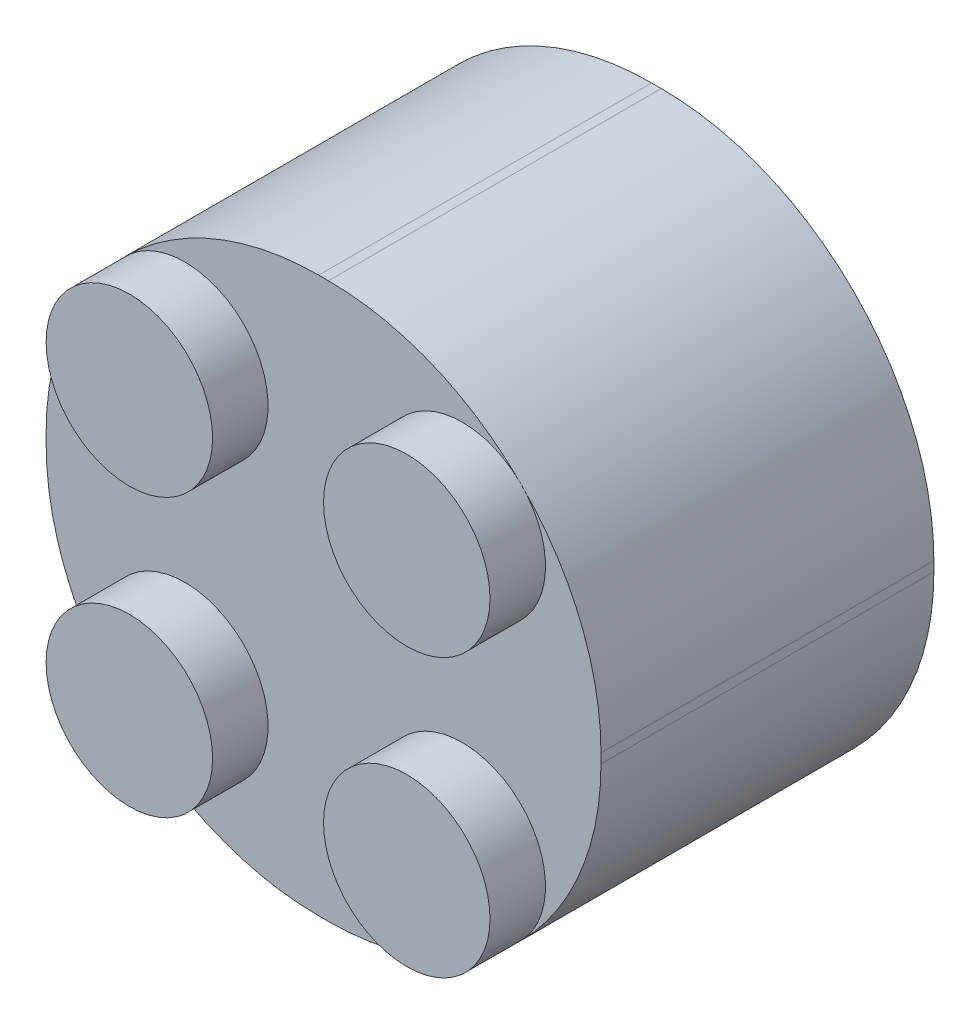
ISO-10303-21;
HEADER;
FILE_DESCRIPTION(('STEP AP214'),'2;1');
FILE_NAME('part.step','',(''),(''),'','','');
FILE_SCHEMA(('AUTOMOTIVE_DESIGN { 1 0 10303 214 1 1 1 1 }'));
ENDSEC;
DATA;
#1=APPLICATION_CONTEXT('core data for automotive mechanical design processes');
#2=APPLICATION_PROTOCOL_DEFINITION('international standard','automotive_design',2000,#1);
#3=PRODUCT_CONTEXT('',#1,'mechanical');
#4=PRODUCT('Part','Part','',(#3));
#5=PRODUCT_RELATED_PRODUCT_CATEGORY('part','',(#4));
#6=PRODUCT_DEFINITION_FORMATION('','',#4);
#7=PRODUCT_DEFINITION_CONTEXT('part definition',#1,'design');
#8=PRODUCT_DEFINITION('design','',#6,#7);
#9=PRODUCT_DEFINITION_SHAPE('','',#8);
#10=(LENGTH_UNIT() NAMED_UNIT(*) SI_UNIT(.MILLI.,.METRE.));
#11=(NAMED_UNIT(*) PLANE_ANGLE_UNIT() SI_UNIT($,.RADIAN.));
#12=(NAMED_UNIT(*) SI_UNIT($,.STERADIAN.) SOLID_ANGLE_UNIT());
#13=UNCERTAINTY_MEASURE_WITH_UNIT(LENGTH_MEASURE(1.E-05),#10,'distance_accuracy_value','');
#14=(GEOMETRIC_REPRESENTATION_CONTEXT(3) GLOBAL_UNCERTAINTY_ASSIGNED_CONTEXT((#13)) GLOBAL_UNIT_ASSIGNED_CONTEXT((#10,
#11,#12)) REPRESENTATION_CONTEXT('',''));
#15=CARTESIAN_POINT('',(0.,0.,0.));
#16=DIRECTION('',(0.,0.,1.));
#17=DIRECTION('',(1.,0.,0.));
#18=AXIS2_PLACEMENT_3D('',#15,#16,#17);
#19=CARTESIAN_POINT('',(0.,0.,8.));
#20=DIRECTION('',(0.,0.,-1.));
#21=DIRECTION('',(-1.,0.,0.));
#22=AXIS2_PLACEMENT_3D('',#19,#20,#21);
#23=PLANE('',#22);
#24=CARTESIAN_POINT('',(4.,12.,8.));
#25=DIRECTION('',(0.,0.,-1.));
#26=DIRECTION('',(-1.,0.,0.));
#27=AXIS2_PLACEMENT_3D('',#24,#25,#26);
#28=CIRCLE('',#27,0.800000000000001);
#29=CARTESIAN_POINT('',(3.2,12.,8.));
#30=VERTEX_POINT('',#29);
#31=EDGE_CURVE('E171',#30,#30,#28,.F.);
#32=ORIENTED_EDGE('',*,*,#31,.T.);
#33=EDGE_LOOP('',(#32));
#34=FACE_BOUND('',#33,.T.);
#35=DIRECTION('',(0.,1.,0.));
#36=VECTOR('',#35,1.);
#37=CARTESIAN_POINT('',(14.4,0.,8.));
#38=LINE('',#37,#36);
#39=CARTESIAN_POINT('',(14.4,7.86,8.));
#40=VERTEX_POINT('',#39);
#41=CARTESIAN_POINT('',(14.4,8.14,8.));
#42=VERTEX_POINT('',#41);
#43=EDGE_CURVE('E172',#40,#42,#38,.T.);
#44=ORIENTED_EDGE('',*,*,#43,.F.);
#45=CARTESIAN_POINT('',(8.14,7.86,8.));
#46=DIRECTION('',(0.,0.,-1.));
#47=DIRECTION('',(-1.,0.,0.));
#48=AXIS2_PLACEMENT_3D('',#45,#46,#47);
#49=CIRCLE('',#48,6.26);
#50=CARTESIAN_POINT('',(8.14,1.6,8.));
#51=VERTEX_POINT('',#50);
#52=EDGE_CURVE('E161',#51,#40,#49,.F.);
#53=ORIENTED_EDGE('',*,*,#52,.F.);
#54=DIRECTION('',(1.,0.,0.));
#55=VECTOR('',#54,1.);
#56=CARTESIAN_POINT('',(0.,1.6,8.));
#57=LINE('',#56,#55);
#58=CARTESIAN_POINT('',(7.86,1.6,8.));
#59=VERTEX_POINT('',#58);
#60=EDGE_CURVE('E392',#59,#51,#57,.T.);
#61=ORIENTED_EDGE('',*,*,#60,.F.);
#62=CARTESIAN_POINT('',(7.86,7.86,8.));
#63=DIRECTION('',(0.,0.,-1.));
#64=DIRECTION('',(-1.,0.,0.));
#65=AXIS2_PLACEMENT_3D('',#62,#63,#64);
#66=CIRCLE('',#65,6.26);
#67=CARTESIAN_POINT('',(1.6,7.86,8.));
#68=VERTEX_POINT('',#67);
#69=EDGE_CURVE('E395',#68,#59,#66,.F.);
#70=ORIENTED_EDGE('',*,*,#69,.F.);
#71=DIRECTION('',(0.,-1.,0.));
#72=VECTOR('',#71,1.);
#73=CARTESIAN_POINT('',(1.6,0.,8.));
#74=LINE('',#73,#72);
#75=CARTESIAN_POINT('',(1.6,8.14,8.));
#76=VERTEX_POINT('',#75);
#77=EDGE_CURVE('E205',#76,#68,#74,.T.);
#78=ORIENTED_EDGE('',*,*,#77,.F.);
#79=CARTESIAN_POINT('',(7.86,8.14,8.));
#80=DIRECTION('',(0.,0.,-1.));
#81=DIRECTION('',(-1.,0.,0.));
#82=AXIS2_PLACEMENT_3D('',#79,#80,#81);
#83=CIRCLE('',#82,6.26);
#84=CARTESIAN_POINT('',(7.86,14.4,8.));
#85=VERTEX_POINT('',#84);
#86=EDGE_CURVE('E168',#85,#76,#83,.F.);
#87=ORIENTED_EDGE('',*,*,#86,.F.);
#88=DIRECTION('',(-1.,0.,0.));
#89=VECTOR('',#88,1.);
#90=CARTESIAN_POINT('',(0.,14.4,8.));
#91=LINE('',#90,#89);
#92=CARTESIAN_POINT('',(8.14,14.4,8.));
#93=VERTEX_POINT('',#92);
#94=EDGE_CURVE('E165',#93,#85,#91,.T.);
#95=ORIENTED_EDGE('',*,*,#94,.F.);
#96=CARTESIAN_POINT('',(8.14,8.14,8.));
#97=DIRECTION('',(0.,0.,-1.));
#98=DIRECTION('',(-1.,0.,0.));
#99=AXIS2_PLACEMENT_3D('',#96,#97,#98);
#100=CIRCLE('',#99,6.26);
#101=EDGE_CURVE('E149',#42,#93,#100,.F.);
#102=ORIENTED_EDGE('',*,*,#101,.F.);
#103=EDGE_LOOP('',(#44,#53,#61,#70,#78,#87,#95,#102));
#104=FACE_BOUND('',#103,.T.);
#105=CARTESIAN_POINT('',(12.,12.,8.));
#106=DIRECTION('',(0.,0.,-1.));
#107=DIRECTION('',(-1.,0.,0.));
#108=AXIS2_PLACEMENT_3D('',#105,#106,#107);
#109=CIRCLE('',#108,0.800000000000001);
#110=CARTESIAN_POINT('',(11.2,12.,8.));
#111=VERTEX_POINT('',#110);
#112=EDGE_CURVE('E391',#111,#111,#109,.F.);
#113=ORIENTED_EDGE('',*,*,#112,.T.);
#114=EDGE_LOOP('',(#113));
#115=FACE_BOUND('',#114,.T.);
#116=CARTESIAN_POINT('',(4.,4.,8.));
#117=DIRECTION('',(0.,0.,-1.));
#118=DIRECTION('',(-1.,0.,0.));
#119=AXIS2_PLACEMENT_3D('',#116,#117,#118);
#120=CIRCLE('',#119,0.800000000000001);
#121=CARTESIAN_POINT('',(3.2,4.,8.));
#122=VERTEX_POINT('',#121);
#123=EDGE_CURVE('E199',#122,#122,#120,.F.);
#124=ORIENTED_EDGE('',*,*,#123,.T.);
#125=EDGE_LOOP('',(#124));
#126=FACE_BOUND('',#125,.T.);
#127=CARTESIAN_POINT('',(12.,4.,8.));
#128=DIRECTION('',(0.,0.,-1.));
#129=DIRECTION('',(-1.,0.,0.));
#130=AXIS2_PLACEMENT_3D('',#127,#128,#129);
#131=CIRCLE('',#130,0.800000000000001);
#132=CARTESIAN_POINT('',(11.2,4.,8.));
#133=VERTEX_POINT('',#132);
#134=EDGE_CURVE('E198',#133,#133,#131,.F.);
#135=ORIENTED_EDGE('',*,*,#134,.T.);
#136=EDGE_LOOP('',(#135));
#137=FACE_BOUND('',#136,.T.);
#138=CARTESIAN_POINT('',(8.,7.99999999930367,8.));
#139=DIRECTION('',(0.,0.,-1.));
#140=DIRECTION('',(-1.,0.,0.));
#141=AXIS2_PLACEMENT_3D('',#138,#139,#140);
#142=CIRCLE('',#141,3.256);
#143=CARTESIAN_POINT('',(4.744,7.99999999930367,8.));
#144=VERTEX_POINT('',#143);
#145=EDGE_CURVE('E384',#144,#144,#142,.T.);
#146=ORIENTED_EDGE('',*,*,#145,.F.);
#147=EDGE_LOOP('',(#146));
#148=FACE_BOUND('',#147,.T.);
#149=ADVANCED_FACE('F33',(#34,#104,#115,#126,#137,#148),#23,.T.);
#150=CARTESIAN_POINT('',(0.,0.,0.));
#151=DIRECTION('',(0.,0.,-1.));
#152=DIRECTION('',(-1.,0.,0.));
#153=AXIS2_PLACEMENT_3D('',#150,#151,#152);
#154=PLANE('',#153);
#155=DIRECTION('',(-1.,0.,0.));
#156=VECTOR('',#155,1.);
#157=CARTESIAN_POINT('',(0.,16.,0.));
#158=LINE('',#157,#156);
#159=CARTESIAN_POINT('',(8.14,16.,0.));
#160=VERTEX_POINT('',#159);
#161=CARTESIAN_POINT('',(7.86,16.,0.));
#162=VERTEX_POINT('',#161);
#163=EDGE_CURVE('E229',#160,#162,#158,.T.);
#164=ORIENTED_EDGE('',*,*,#163,.F.);
#165=CARTESIAN_POINT('',(8.14,8.14,0.));
#166=DIRECTION('',(0.,0.,-1.));
#167=DIRECTION('',(-1.,0.,0.));
#168=AXIS2_PLACEMENT_3D('',#165,#166,#167);
#169=CIRCLE('',#168,7.86);
#170=CARTESIAN_POINT('',(16.,8.14,0.));
#171=VERTEX_POINT('',#170);
#172=EDGE_CURVE('E275',#160,#171,#169,.T.);
#173=ORIENTED_EDGE('',*,*,#172,.T.);
#174=DIRECTION('',(0.,1.,0.));
#175=VECTOR('',#174,1.);
#176=CARTESIAN_POINT('',(16.,0.,0.));
#177=LINE('',#176,#175);
#178=CARTESIAN_POINT('',(16.,7.86,0.));
#179=VERTEX_POINT('',#178);
#180=EDGE_CURVE('E242',#179,#171,#177,.T.);
#181=ORIENTED_EDGE('',*,*,#180,.F.);
#182=CARTESIAN_POINT('',(8.14,7.86,0.));
#183=DIRECTION('',(0.,0.,-1.));
#184=DIRECTION('',(-1.,0.,0.));
#185=AXIS2_PLACEMENT_3D('',#182,#183,#184);
#186=CIRCLE('',#185,7.86);
#187=CARTESIAN_POINT('',(8.14,0.,0.));
#188=VERTEX_POINT('',#187);
#189=EDGE_CURVE('E273',#179,#188,#186,.T.);
#190=ORIENTED_EDGE('',*,*,#189,.T.);
#191=DIRECTION('',(1.,0.,0.));
#192=VECTOR('',#191,1.);
#193=CARTESIAN_POINT('',(0.,0.,0.));
#194=LINE('',#193,#192);
#195=CARTESIAN_POINT('',(7.86,0.,0.));
#196=VERTEX_POINT('',#195);
#197=EDGE_CURVE('E240',#196,#188,#194,.T.);
#198=ORIENTED_EDGE('',*,*,#197,.F.);
#199=CARTESIAN_POINT('',(7.86,7.86,0.));
#200=DIRECTION('',(0.,0.,-1.));
#201=DIRECTION('',(-1.,0.,0.));
#202=AXIS2_PLACEMENT_3D('',#199,#200,#201);
#203=CIRCLE('',#202,7.86);
#204=CARTESIAN_POINT('',(0.,7.86,0.));
#205=VERTEX_POINT('',#204);
#206=EDGE_CURVE('E271',#196,#205,#203,.T.);
#207=ORIENTED_EDGE('',*,*,#206,.T.);
#208=DIRECTION('',(0.,-1.,0.));
#209=VECTOR('',#208,1.);
#210=CARTESIAN_POINT('',(0.,0.,0.));
#211=LINE('',#210,#209);
#212=CARTESIAN_POINT('',(0.,8.14,0.));
#213=VERTEX_POINT('',#212);
#214=EDGE_CURVE('E224',#213,#205,#211,.T.);
#215=ORIENTED_EDGE('',*,*,#214,.F.);
#216=CARTESIAN_POINT('',(7.86,8.14,0.));
#217=DIRECTION('',(0.,0.,-1.));
#218=DIRECTION('',(-1.,0.,0.));
#219=AXIS2_PLACEMENT_3D('',#216,#217,#218);
#220=CIRCLE('',#219,7.86);
#221=EDGE_CURVE('E269',#213,#162,#220,.T.);
#222=ORIENTED_EDGE('',*,*,#221,.T.);
#223=EDGE_LOOP('',(#164,#173,#181,#190,#198,#207,#215,#222));
#224=FACE_BOUND('',#223,.T.);
#225=CARTESIAN_POINT('',(8.14,8.14,0.));
#226=DIRECTION('',(0.,0.,-1.));
#227=DIRECTION('',(-1.,0.,0.));
#228=AXIS2_PLACEMENT_3D('',#225,#226,#227);
#229=CIRCLE('',#228,6.26);
#230=CARTESIAN_POINT('',(8.14,14.4,0.));
#231=VERTEX_POINT('',#230);
#232=CARTESIAN_POINT('',(14.4,8.14,0.));
#233=VERTEX_POINT('',#232);
#234=EDGE_CURVE('E207',#231,#233,#229,.T.);
#235=ORIENTED_EDGE('',*,*,#234,.F.);
#236=DIRECTION('',(-1.,0.,0.));
#237=VECTOR('',#236,1.);
#238=CARTESIAN_POINT('',(0.,14.4,0.));
#239=LINE('',#238,#237);
#240=CARTESIAN_POINT('',(7.86,14.4,0.));
#241=VERTEX_POINT('',#240);
#242=EDGE_CURVE('E176',#231,#241,#239,.T.);
#243=ORIENTED_EDGE('',*,*,#242,.T.);
#244=CARTESIAN_POINT('',(7.86,8.14,0.));
#245=DIRECTION('',(0.,0.,-1.));
#246=DIRECTION('',(-1.,0.,0.));
#247=AXIS2_PLACEMENT_3D('',#244,#245,#246);
#248=CIRCLE('',#247,6.26);
#249=CARTESIAN_POINT('',(1.6,8.14,0.));
#250=VERTEX_POINT('',#249);
#251=EDGE_CURVE('E178',#250,#241,#248,.T.);
#252=ORIENTED_EDGE('',*,*,#251,.F.);
#253=DIRECTION('',(0.,-1.,0.));
#254=VECTOR('',#253,1.);
#255=CARTESIAN_POINT('',(1.6,0.,0.));
#256=LINE('',#255,#254);
#257=CARTESIAN_POINT('',(1.6,7.86,0.));
#258=VERTEX_POINT('',#257);
#259=EDGE_CURVE('E48',#250,#258,#256,.T.);
#260=ORIENTED_EDGE('',*,*,#259,.T.);
#261=CARTESIAN_POINT('',(7.86,7.86,0.));
#262=DIRECTION('',(0.,0.,-1.));
#263=DIRECTION('',(-1.,0.,0.));
#264=AXIS2_PLACEMENT_3D('',#261,#262,#263);
#265=CIRCLE('',#264,6.26);
#266=CARTESIAN_POINT('',(7.86,1.6,0.));
#267=VERTEX_POINT('',#266);
#268=EDGE_CURVE('E181',#267,#258,#265,.T.);
#269=ORIENTED_EDGE('',*,*,#268,.F.);
#270=DIRECTION('',(1.,0.,0.));
#271=VECTOR('',#270,1.);
#272=CARTESIAN_POINT('',(0.,1.6,0.));
#273=LINE('',#272,#271);
#274=CARTESIAN_POINT('',(8.14,1.6,0.));
#275=VERTEX_POINT('',#274);
#276=EDGE_CURVE('E202',#267,#275,#273,.T.);
#277=ORIENTED_EDGE('',*,*,#276,.T.);
#278=CARTESIAN_POINT('',(8.14,7.86,0.));
#279=DIRECTION('',(0.,0.,-1.));
#280=DIRECTION('',(-1.,0.,0.));
#281=AXIS2_PLACEMENT_3D('',#278,#279,#280);
#282=CIRCLE('',#281,6.26);
#283=CARTESIAN_POINT('',(14.4,7.86,0.));
#284=VERTEX_POINT('',#283);
#285=EDGE_CURVE('E210',#284,#275,#282,.T.);
#286=ORIENTED_EDGE('',*,*,#285,.F.);
#287=DIRECTION('',(0.,1.,0.));
#288=VECTOR('',#287,1.);
#289=CARTESIAN_POINT('',(14.4,0.,0.));
#290=LINE('',#289,#288);
#291=EDGE_CURVE('E206',#284,#233,#290,.T.);
#292=ORIENTED_EDGE('',*,*,#291,.T.);
#293=EDGE_LOOP('',(#235,#243,#252,#260,#269,#277,#286,#292));
#294=FACE_BOUND('',#293,.T.);
#295=ADVANCED_FACE('F314',(#224,#294),#154,.T.);
#296=CARTESIAN_POINT('',(0.,0.,9.6));
#297=DIRECTION('',(0.,0.,-1.));
#298=DIRECTION('',(-1.,0.,0.));
#299=AXIS2_PLACEMENT_3D('',#296,#297,#298);
#300=PLANE('',#299);
#301=CARTESIAN_POINT('',(4.,12.,9.6));
#302=DIRECTION('',(0.,0.,-1.));
#303=DIRECTION('',(-1.,0.,0.));
#304=AXIS2_PLACEMENT_3D('',#301,#302,#303);
#305=CIRCLE('',#304,2.4);
#306=CARTESIAN_POINT('',(1.6,12.,9.6));
#307=VERTEX_POINT('',#306);
#308=EDGE_CURVE('E237',#307,#307,#305,.F.);
#309=ORIENTED_EDGE('',*,*,#308,.F.);
#310=EDGE_LOOP('',(#309));
#311=FACE_BOUND('',#310,.T.);
#312=DIRECTION('',(0.,1.,0.));
#313=VECTOR('',#312,1.);
#314=CARTESIAN_POINT('',(16.,0.,9.6));
#315=LINE('',#314,#313);
#316=CARTESIAN_POINT('',(16.,7.86,9.6));
#317=VERTEX_POINT('',#316);
#318=CARTESIAN_POINT('',(16.,8.14,9.6));
#319=VERTEX_POINT('',#318);
#320=EDGE_CURVE('E231',#317,#319,#315,.T.);
#321=ORIENTED_EDGE('',*,*,#320,.T.);
#322=CARTESIAN_POINT('',(8.14,8.14,9.6));
#323=DIRECTION('',(0.,0.,-1.));
#324=DIRECTION('',(-1.,0.,0.));
#325=AXIS2_PLACEMENT_3D('',#322,#323,#324);
#326=CIRCLE('',#325,7.86);
#327=CARTESIAN_POINT('',(8.14,16.,9.6));
#328=VERTEX_POINT('',#327);
#329=EDGE_CURVE('E288',#319,#328,#326,.F.);
#330=ORIENTED_EDGE('',*,*,#329,.T.);
#331=DIRECTION('',(-1.,0.,0.));
#332=VECTOR('',#331,1.);
#333=CARTESIAN_POINT('',(0.,16.,9.6));
#334=LINE('',#333,#332);
#335=CARTESIAN_POINT('',(7.86,16.,9.6));
#336=VERTEX_POINT('',#335);
#337=EDGE_CURVE('E234',#328,#336,#334,.T.);
#338=ORIENTED_EDGE('',*,*,#337,.T.);
#339=CARTESIAN_POINT('',(7.86,8.14,9.6));
#340=DIRECTION('',(0.,0.,-1.));
#341=DIRECTION('',(-1.,0.,0.));
#342=AXIS2_PLACEMENT_3D('',#339,#340,#341);
#343=CIRCLE('',#342,7.86);
#344=CARTESIAN_POINT('',(0.,8.14,9.6));
#345=VERTEX_POINT('',#344);
#346=EDGE_CURVE('E282',#336,#345,#343,.F.);
#347=ORIENTED_EDGE('',*,*,#346,.T.);
#348=DIRECTION('',(0.,-1.,0.));
#349=VECTOR('',#348,1.);
#350=CARTESIAN_POINT('',(0.,0.,9.6));
#351=LINE('',#350,#349);
#352=CARTESIAN_POINT('',(0.,7.86,9.6));
#353=VERTEX_POINT('',#352);
#354=EDGE_CURVE('E225',#345,#353,#351,.T.);
#355=ORIENTED_EDGE('',*,*,#354,.T.);
#356=CARTESIAN_POINT('',(7.86,7.86,9.6));
#357=DIRECTION('',(0.,0.,-1.));
#358=DIRECTION('',(-1.,0.,0.));
#359=AXIS2_PLACEMENT_3D('',#356,#357,#358);
#360=CIRCLE('',#359,7.86);
#361=CARTESIAN_POINT('',(7.86,0.,9.6));
#362=VERTEX_POINT('',#361);
#363=EDGE_CURVE('E284',#353,#362,#360,.F.);
#364=ORIENTED_EDGE('',*,*,#363,.T.);
#365=DIRECTION('',(1.,0.,0.));
#366=VECTOR('',#365,1.);
#367=CARTESIAN_POINT('',(0.,0.,9.6));
#368=LINE('',#367,#366);
#369=CARTESIAN_POINT('',(8.14,0.,9.6));
#370=VERTEX_POINT('',#369);
#371=EDGE_CURVE('E228',#362,#370,#368,.T.);
#372=ORIENTED_EDGE('',*,*,#371,.T.);
#373=CARTESIAN_POINT('',(8.14,7.86,9.6));
#374=DIRECTION('',(0.,0.,-1.));
#375=DIRECTION('',(-1.,0.,0.));
#376=AXIS2_PLACEMENT_3D('',#373,#374,#375);
#377=CIRCLE('',#376,7.86);
#378=EDGE_CURVE('E286',#370,#317,#377,.F.);
#379=ORIENTED_EDGE('',*,*,#378,.T.);
#380=EDGE_LOOP('',(#321,#330,#338,#347,#355,#364,#372,#379));
#381=FACE_BOUND('',#380,.T.);
#382=CARTESIAN_POINT('',(12.,12.,9.6));
#383=DIRECTION('',(0.,0.,-1.));
#384=DIRECTION('',(-1.,0.,0.));
#385=AXIS2_PLACEMENT_3D('',#382,#383,#384);
#386=CIRCLE('',#385,2.4);
#387=CARTESIAN_POINT('',(9.6,12.,9.6));
#388=VERTEX_POINT('',#387);
#389=EDGE_CURVE('E249',#388,#388,#386,.F.);
#390=ORIENTED_EDGE('',*,*,#389,.F.);
#391=EDGE_LOOP('',(#390));
#392=FACE_BOUND('',#391,.T.);
#393=CARTESIAN_POINT('',(4.,4.,9.6));
#394=DIRECTION('',(0.,0.,-1.));
#395=DIRECTION('',(-1.,0.,0.));
#396=AXIS2_PLACEMENT_3D('',#393,#394,#395);
#397=CIRCLE('',#396,2.4);
#398=CARTESIAN_POINT('',(1.6,4.,9.6));
#399=VERTEX_POINT('',#398);
#400=EDGE_CURVE('E252',#399,#399,#397,.F.);
#401=ORIENTED_EDGE('',*,*,#400,.F.);
#402=EDGE_LOOP('',(#401));
#403=FACE_BOUND('',#402,.T.);
#404=CARTESIAN_POINT('',(12.,4.,9.6));
#405=DIRECTION('',(0.,0.,-1.));
#406=DIRECTION('',(-1.,0.,0.));
#407=AXIS2_PLACEMENT_3D('',#404,#405,#406);
#408=CIRCLE('',#407,2.4);
#409=CARTESIAN_POINT('',(9.6,4.,9.6));
#410=VERTEX_POINT('',#409);
#411=EDGE_CURVE('E258',#410,#410,#408,.F.);
#412=ORIENTED_EDGE('',*,*,#411,.F.);
#413=EDGE_LOOP('',(#412));
#414=FACE_BOUND('',#413,.T.);
#415=ADVANCED_FACE('F305',(#311,#381,#392,#403,#414),#300,.F.);
#416=CARTESIAN_POINT('',(0.,0.,9.6));
#417=DIRECTION('',(1.,0.,0.));
#418=DIRECTION('',(0.,0.,-1.));
#419=AXIS2_PLACEMENT_3D('',#416,#417,#418);
#420=PLANE('',#419);
#421=ORIENTED_EDGE('',*,*,#214,.T.);
#422=DIRECTION('',(0.,0.,-1.));
#423=VECTOR('',#422,1.);
#424=CARTESIAN_POINT('',(0.,7.86,9.6));
#425=LINE('',#424,#423);
#426=EDGE_CURVE('E41',#205,#353,#425,.F.);
#427=ORIENTED_EDGE('',*,*,#426,.T.);
#428=ORIENTED_EDGE('',*,*,#354,.F.);
#429=DIRECTION('',(0.,0.,-1.));
#430=VECTOR('',#429,1.);
#431=CARTESIAN_POINT('',(0.,8.14,9.6));
#432=LINE('',#431,#430);
#433=EDGE_CURVE('E294',#345,#213,#432,.T.);
#434=ORIENTED_EDGE('',*,*,#433,.T.);
#435=EDGE_LOOP('',(#421,#427,#428,#434));
#436=FACE_BOUND('',#435,.T.);
#437=ADVANCED_FACE('F299',(#436),#420,.F.);
#438=CARTESIAN_POINT('',(0.,0.,9.6));
#439=DIRECTION('',(0.,1.,0.));
#440=DIRECTION('',(0.,0.,1.));
#441=AXIS2_PLACEMENT_3D('',#438,#439,#440);
#442=PLANE('',#441);
#443=ORIENTED_EDGE('',*,*,#197,.T.);
#444=DIRECTION('',(0.,0.,-1.));
#445=VECTOR('',#444,1.);
#446=CARTESIAN_POINT('',(8.14,0.,9.6));
#447=LINE('',#446,#445);
#448=EDGE_CURVE('E56',#188,#370,#447,.F.);
#449=ORIENTED_EDGE('',*,*,#448,.T.);
#450=ORIENTED_EDGE('',*,*,#371,.F.);
#451=DIRECTION('',(0.,0.,-1.));
#452=VECTOR('',#451,1.);
#453=CARTESIAN_POINT('',(7.86,0.,9.6));
#454=LINE('',#453,#452);
#455=EDGE_CURVE('E290',#362,#196,#454,.T.);
#456=ORIENTED_EDGE('',*,*,#455,.T.);
#457=EDGE_LOOP('',(#443,#449,#450,#456));
#458=FACE_BOUND('',#457,.T.);
#459=ADVANCED_FACE('F311',(#458),#442,.F.);
#460=CARTESIAN_POINT('',(16.,0.,9.6));
#461=DIRECTION('',(-1.,0.,0.));
#462=DIRECTION('',(0.,0.,1.));
#463=AXIS2_PLACEMENT_3D('',#460,#461,#462);
#464=PLANE('',#463);
#465=ORIENTED_EDGE('',*,*,#180,.T.);
#466=DIRECTION('',(0.,0.,-1.));
#467=VECTOR('',#466,1.);
#468=CARTESIAN_POINT('',(16.,8.14,9.6));
#469=LINE('',#468,#467);
#470=EDGE_CURVE('E280',#171,#319,#469,.F.);
#471=ORIENTED_EDGE('',*,*,#470,.T.);
#472=ORIENTED_EDGE('',*,*,#320,.F.);
#473=DIRECTION('',(0.,0.,-1.));
#474=VECTOR('',#473,1.);
#475=CARTESIAN_POINT('',(16.,7.86,9.6));
#476=LINE('',#475,#474);
#477=EDGE_CURVE('E277',#317,#179,#476,.T.);
#478=ORIENTED_EDGE('',*,*,#477,.T.);
#479=EDGE_LOOP('',(#465,#471,#472,#478));
#480=FACE_BOUND('',#479,.T.);
#481=ADVANCED_FACE('F323',(#480),#464,.F.);
#482=CARTESIAN_POINT('',(0.,16.,9.6));
#483=DIRECTION('',(0.,-1.,0.));
#484=DIRECTION('',(0.,0.,-1.));
#485=AXIS2_PLACEMENT_3D('',#482,#483,#484);
#486=PLANE('',#485);
#487=ORIENTED_EDGE('',*,*,#337,.F.);
#488=DIRECTION('',(0.,0.,-1.));
#489=VECTOR('',#488,1.);
#490=CARTESIAN_POINT('',(8.14,16.,9.6));
#491=LINE('',#490,#489);
#492=EDGE_CURVE('E266',#328,#160,#491,.T.);
#493=ORIENTED_EDGE('',*,*,#492,.T.);
#494=ORIENTED_EDGE('',*,*,#163,.T.);
#495=DIRECTION('',(0.,0.,-1.));
#496=VECTOR('',#495,1.);
#497=CARTESIAN_POINT('',(7.86,16.,9.6));
#498=LINE('',#497,#496);
#499=EDGE_CURVE('E264',#162,#336,#498,.F.);
#500=ORIENTED_EDGE('',*,*,#499,.T.);
#501=EDGE_LOOP('',(#487,#493,#494,#500));
#502=FACE_BOUND('',#501,.T.);
#503=ADVANCED_FACE('F331',(#502),#486,.F.);
#504=CARTESIAN_POINT('',(4.,12.,11.2));
#505=DIRECTION('',(0.,0.,-1.));
#506=DIRECTION('',(-1.,0.,0.));
#507=AXIS2_PLACEMENT_3D('',#504,#505,#506);
#508=CYLINDRICAL_SURFACE('',#507,2.4);
#509=CARTESIAN_POINT('',(4.,12.,11.2));
#510=DIRECTION('',(0.,0.,1.));
#511=DIRECTION('',(1.,0.,0.));
#512=AXIS2_PLACEMENT_3D('',#509,#510,#511);
#513=CIRCLE('',#512,2.4);
#514=CARTESIAN_POINT('',(6.4,12.,11.2));
#515=VERTEX_POINT('',#514);
#516=EDGE_CURVE('E220',#515,#515,#513,.T.);
#517=ORIENTED_EDGE('',*,*,#516,.F.);
#518=EDGE_LOOP('',(#517));
#519=FACE_BOUND('',#518,.T.);
#520=ORIENTED_EDGE('',*,*,#308,.T.);
#521=EDGE_LOOP('',(#520));
#522=FACE_BOUND('',#521,.T.);
#523=ADVANCED_FACE('F450',(#519,#522),#508,.T.);
#524=CARTESIAN_POINT('',(4.,12.,11.2));
#525=DIRECTION('',(0.,0.,1.));
#526=DIRECTION('',(1.,0.,0.));
#527=AXIS2_PLACEMENT_3D('',#524,#525,#526);
#528=PLANE('',#527);
#529=ORIENTED_EDGE('',*,*,#516,.T.);
#530=EDGE_LOOP('',(#529));
#531=FACE_BOUND('',#530,.T.);
#532=ADVANCED_FACE('F446',(#531),#528,.T.);
#533=CARTESIAN_POINT('',(12.,12.,11.2));
#534=DIRECTION('',(0.,0.,-1.));
#535=DIRECTION('',(-1.,0.,0.));
#536=AXIS2_PLACEMENT_3D('',#533,#534,#535);
#537=CYLINDRICAL_SURFACE('',#536,2.4);
#538=CARTESIAN_POINT('',(12.,12.,11.2));
#539=DIRECTION('',(0.,0.,1.));
#540=DIRECTION('',(1.,0.,0.));
#541=AXIS2_PLACEMENT_3D('',#538,#539,#540);
#542=CIRCLE('',#541,2.4);
#543=CARTESIAN_POINT('',(14.4,12.,11.2));
#544=VERTEX_POINT('',#543);
#545=EDGE_CURVE('E217',#544,#544,#542,.T.);
#546=ORIENTED_EDGE('',*,*,#545,.F.);
#547=EDGE_LOOP('',(#546));
#548=FACE_BOUND('',#547,.T.);
#549=ORIENTED_EDGE('',*,*,#389,.T.);
#550=EDGE_LOOP('',(#549));
#551=FACE_BOUND('',#550,.T.);
#552=ADVANCED_FACE('F442',(#548,#551),#537,.T.);
#553=CARTESIAN_POINT('',(12.,12.,11.2));
#554=DIRECTION('',(0.,0.,1.));
#555=DIRECTION('',(1.,0.,0.));
#556=AXIS2_PLACEMENT_3D('',#553,#554,#555);
#557=PLANE('',#556);
#558=ORIENTED_EDGE('',*,*,#545,.T.);
#559=EDGE_LOOP('',(#558));
#560=FACE_BOUND('',#559,.T.);
#561=ADVANCED_FACE('F438',(#560),#557,.T.);
#562=CARTESIAN_POINT('',(4.,4.,11.2));
#563=DIRECTION('',(0.,0.,1.));
#564=DIRECTION('',(1.,0.,0.));
#565=AXIS2_PLACEMENT_3D('',#562,#563,#564);
#566=PLANE('',#565);
#567=CARTESIAN_POINT('',(4.,4.,11.2));
#568=DIRECTION('',(0.,0.,1.));
#569=DIRECTION('',(1.,0.,0.));
#570=AXIS2_PLACEMENT_3D('',#567,#568,#569);
#571=CIRCLE('',#570,2.4);
#572=CARTESIAN_POINT('',(6.4,4.,11.2));
#573=VERTEX_POINT('',#572);
#574=EDGE_CURVE('E255',#573,#573,#571,.T.);
#575=ORIENTED_EDGE('',*,*,#574,.T.);
#576=EDGE_LOOP('',(#575));
#577=FACE_BOUND('',#576,.T.);
#578=ADVANCED_FACE('F441',(#577),#566,.T.);
#579=CARTESIAN_POINT('',(4.,4.,11.2));
#580=DIRECTION('',(0.,0.,-1.));
#581=DIRECTION('',(-1.,0.,0.));
#582=AXIS2_PLACEMENT_3D('',#579,#580,#581);
#583=CYLINDRICAL_SURFACE('',#582,2.4);
#584=ORIENTED_EDGE('',*,*,#574,.F.);
#585=EDGE_LOOP('',(#584));
#586=FACE_BOUND('',#585,.T.);
#587=ORIENTED_EDGE('',*,*,#400,.T.);
#588=EDGE_LOOP('',(#587));
#589=FACE_BOUND('',#588,.T.);
#590=ADVANCED_FACE('F466',(#586,#589),#583,.T.);
#591=CARTESIAN_POINT('',(12.,4.,11.2));
#592=DIRECTION('',(0.,0.,1.));
#593=DIRECTION('',(1.,0.,0.));
#594=AXIS2_PLACEMENT_3D('',#591,#592,#593);
#595=PLANE('',#594);
#596=CARTESIAN_POINT('',(12.,4.,11.2));
#597=DIRECTION('',(0.,0.,1.));
#598=DIRECTION('',(1.,0.,0.));
#599=AXIS2_PLACEMENT_3D('',#596,#597,#598);
#600=CIRCLE('',#599,2.4);
#601=CARTESIAN_POINT('',(14.4,4.,11.2));
#602=VERTEX_POINT('',#601);
#603=EDGE_CURVE('E261',#602,#602,#600,.T.);
#604=ORIENTED_EDGE('',*,*,#603,.T.);
#605=EDGE_LOOP('',(#604));
#606=FACE_BOUND('',#605,.T.);
#607=ADVANCED_FACE('F469',(#606),#595,.T.);
#608=CARTESIAN_POINT('',(12.,4.,11.2));
#609=DIRECTION('',(0.,0.,-1.));
#610=DIRECTION('',(-1.,0.,0.));
#611=AXIS2_PLACEMENT_3D('',#608,#609,#610);
#612=CYLINDRICAL_SURFACE('',#611,2.4);
#613=ORIENTED_EDGE('',*,*,#603,.F.);
#614=EDGE_LOOP('',(#613));
#615=FACE_BOUND('',#614,.T.);
#616=ORIENTED_EDGE('',*,*,#411,.T.);
#617=EDGE_LOOP('',(#616));
#618=FACE_BOUND('',#617,.T.);
#619=ADVANCED_FACE('F474',(#615,#618),#612,.T.);
#620=CARTESIAN_POINT('',(8.14,8.14,9.6));
#621=DIRECTION('',(0.,0.,-1.));
#622=DIRECTION('',(-1.,0.,0.));
#623=AXIS2_PLACEMENT_3D('',#620,#621,#622);
#624=CYLINDRICAL_SURFACE('',#623,7.86);
#625=ORIENTED_EDGE('',*,*,#329,.F.);
#626=ORIENTED_EDGE('',*,*,#470,.F.);
#627=ORIENTED_EDGE('',*,*,#172,.F.);
#628=ORIENTED_EDGE('',*,*,#492,.F.);
#629=EDGE_LOOP('',(#625,#626,#627,#628));
#630=FACE_BOUND('',#629,.T.);
#631=ADVANCED_FACE('F329',(#630),#624,.T.);
#632=CARTESIAN_POINT('',(8.14,7.86,9.6));
#633=DIRECTION('',(0.,0.,-1.));
#634=DIRECTION('',(-1.,0.,0.));
#635=AXIS2_PLACEMENT_3D('',#632,#633,#634);
#636=CYLINDRICAL_SURFACE('',#635,7.86);
#637=ORIENTED_EDGE('',*,*,#378,.F.);
#638=ORIENTED_EDGE('',*,*,#448,.F.);
#639=ORIENTED_EDGE('',*,*,#189,.F.);
#640=ORIENTED_EDGE('',*,*,#477,.F.);
#641=EDGE_LOOP('',(#637,#638,#639,#640));
#642=FACE_BOUND('',#641,.T.);
#643=ADVANCED_FACE('F320',(#642),#636,.T.);
#644=CARTESIAN_POINT('',(7.86,7.86,9.6));
#645=DIRECTION('',(0.,0.,-1.));
#646=DIRECTION('',(-1.,0.,0.));
#647=AXIS2_PLACEMENT_3D('',#644,#645,#646);
#648=CYLINDRICAL_SURFACE('',#647,7.86);
#649=ORIENTED_EDGE('',*,*,#363,.F.);
#650=ORIENTED_EDGE('',*,*,#426,.F.);
#651=ORIENTED_EDGE('',*,*,#206,.F.);
#652=ORIENTED_EDGE('',*,*,#455,.F.);
#653=EDGE_LOOP('',(#649,#650,#651,#652));
#654=FACE_BOUND('',#653,.T.);
#655=ADVANCED_FACE('F309',(#654),#648,.T.);
#656=CARTESIAN_POINT('',(7.86,8.14,9.6));
#657=DIRECTION('',(0.,0.,-1.));
#658=DIRECTION('',(-1.,0.,0.));
#659=AXIS2_PLACEMENT_3D('',#656,#657,#658);
#660=CYLINDRICAL_SURFACE('',#659,7.86);
#661=ORIENTED_EDGE('',*,*,#346,.F.);
#662=ORIENTED_EDGE('',*,*,#499,.F.);
#663=ORIENTED_EDGE('',*,*,#221,.F.);
#664=ORIENTED_EDGE('',*,*,#433,.F.);
#665=EDGE_LOOP('',(#661,#662,#663,#664));
#666=FACE_BOUND('',#665,.T.);
#667=ADVANCED_FACE('F35',(#666),#660,.T.);
#668=CARTESIAN_POINT('',(1.6,0.,9.6));
#669=DIRECTION('',(1.,0.,0.));
#670=DIRECTION('',(0.,0.,-1.));
#671=AXIS2_PLACEMENT_3D('',#668,#669,#670);
#672=PLANE('',#671);
#673=ORIENTED_EDGE('',*,*,#259,.F.);
#674=DIRECTION('',(0.,0.,-1.));
#675=VECTOR('',#674,1.);
#676=CARTESIAN_POINT('',(1.6,8.14,9.6));
#677=LINE('',#676,#675);
#678=EDGE_CURVE('E409',#76,#250,#677,.T.);
#679=ORIENTED_EDGE('',*,*,#678,.F.);
#680=ORIENTED_EDGE('',*,*,#77,.T.);
#681=DIRECTION('',(0.,0.,-1.));
#682=VECTOR('',#681,1.);
#683=CARTESIAN_POINT('',(1.6,7.86,9.6));
#684=LINE('',#683,#682);
#685=EDGE_CURVE('E221',#258,#68,#684,.F.);
#686=ORIENTED_EDGE('',*,*,#685,.F.);
#687=EDGE_LOOP('',(#673,#679,#680,#686));
#688=FACE_BOUND('',#687,.T.);
#689=ADVANCED_FACE('F335',(#688),#672,.T.);
#690=CARTESIAN_POINT('',(0.,1.6,9.6));
#691=DIRECTION('',(0.,1.,0.));
#692=DIRECTION('',(0.,0.,1.));
#693=AXIS2_PLACEMENT_3D('',#690,#691,#692);
#694=PLANE('',#693);
#695=ORIENTED_EDGE('',*,*,#276,.F.);
#696=DIRECTION('',(0.,0.,1.));
#697=VECTOR('',#696,1.);
#698=CARTESIAN_POINT('',(7.86,1.6,9.6));
#699=LINE('',#698,#697);
#700=EDGE_CURVE('E160',#59,#267,#699,.F.);
#701=ORIENTED_EDGE('',*,*,#700,.F.);
#702=ORIENTED_EDGE('',*,*,#60,.T.);
#703=DIRECTION('',(0.,0.,1.));
#704=VECTOR('',#703,1.);
#705=CARTESIAN_POINT('',(8.14,1.6,9.6));
#706=LINE('',#705,#704);
#707=EDGE_CURVE('E411',#275,#51,#706,.T.);
#708=ORIENTED_EDGE('',*,*,#707,.F.);
#709=EDGE_LOOP('',(#695,#701,#702,#708));
#710=FACE_BOUND('',#709,.T.);
#711=ADVANCED_FACE('F340',(#710),#694,.T.);
#712=CARTESIAN_POINT('',(14.4,0.,9.6));
#713=DIRECTION('',(-1.,0.,0.));
#714=DIRECTION('',(0.,0.,1.));
#715=AXIS2_PLACEMENT_3D('',#712,#713,#714);
#716=PLANE('',#715);
#717=ORIENTED_EDGE('',*,*,#291,.F.);
#718=DIRECTION('',(0.,0.,1.));
#719=VECTOR('',#718,1.);
#720=CARTESIAN_POINT('',(14.4,7.86,9.6));
#721=LINE('',#720,#719);
#722=EDGE_CURVE('E209',#40,#284,#721,.F.);
#723=ORIENTED_EDGE('',*,*,#722,.F.);
#724=ORIENTED_EDGE('',*,*,#43,.T.);
#725=DIRECTION('',(0.,0.,1.));
#726=VECTOR('',#725,1.);
#727=CARTESIAN_POINT('',(14.4,8.14,9.6));
#728=LINE('',#727,#726);
#729=EDGE_CURVE('E156',#233,#42,#728,.T.);
#730=ORIENTED_EDGE('',*,*,#729,.F.);
#731=EDGE_LOOP('',(#717,#723,#724,#730));
#732=FACE_BOUND('',#731,.T.);
#733=ADVANCED_FACE('F421',(#732),#716,.T.);
#734=CARTESIAN_POINT('',(0.,14.4,9.6));
#735=DIRECTION('',(0.,-1.,0.));
#736=DIRECTION('',(0.,0.,-1.));
#737=AXIS2_PLACEMENT_3D('',#734,#735,#736);
#738=PLANE('',#737);
#739=ORIENTED_EDGE('',*,*,#94,.T.);
#740=DIRECTION('',(0.,0.,-1.));
#741=VECTOR('',#740,1.);
#742=CARTESIAN_POINT('',(7.86,14.4,9.6));
#743=LINE('',#742,#741);
#744=EDGE_CURVE('E179',#241,#85,#743,.F.);
#745=ORIENTED_EDGE('',*,*,#744,.F.);
#746=ORIENTED_EDGE('',*,*,#242,.F.);
#747=DIRECTION('',(0.,0.,-1.));
#748=VECTOR('',#747,1.);
#749=CARTESIAN_POINT('',(8.14,14.4,9.6));
#750=LINE('',#749,#748);
#751=EDGE_CURVE('E153',#93,#231,#750,.T.);
#752=ORIENTED_EDGE('',*,*,#751,.F.);
#753=EDGE_LOOP('',(#739,#745,#746,#752));
#754=FACE_BOUND('',#753,.T.);
#755=ADVANCED_FACE('F174',(#754),#738,.T.);
#756=CARTESIAN_POINT('',(4.,12.,11.2));
#757=DIRECTION('',(0.,0.,-1.));
#758=DIRECTION('',(-1.,0.,0.));
#759=AXIS2_PLACEMENT_3D('',#756,#757,#758);
#760=CYLINDRICAL_SURFACE('',#759,0.800000000000001);
#761=CARTESIAN_POINT('',(4.,12.,9.6));
#762=DIRECTION('',(0.,0.,1.));
#763=DIRECTION('',(1.,0.,0.));
#764=AXIS2_PLACEMENT_3D('',#761,#762,#763);
#765=CIRCLE('',#764,0.800000000000001);
#766=CARTESIAN_POINT('',(4.8,12.,9.6));
#767=VERTEX_POINT('',#766);
#768=EDGE_CURVE('E188',#767,#767,#765,.T.);
#769=ORIENTED_EDGE('',*,*,#768,.T.);
#770=EDGE_LOOP('',(#769));
#771=FACE_BOUND('',#770,.T.);
#772=ORIENTED_EDGE('',*,*,#31,.F.);
#773=EDGE_LOOP('',(#772));
#774=FACE_BOUND('',#773,.T.);
#775=ADVANCED_FACE('F534',(#771,#774),#760,.F.);
#776=CARTESIAN_POINT('',(4.,12.,9.6));
#777=DIRECTION('',(0.,0.,1.));
#778=DIRECTION('',(1.,0.,0.));
#779=AXIS2_PLACEMENT_3D('',#776,#777,#778);
#780=PLANE('',#779);
#781=ORIENTED_EDGE('',*,*,#768,.F.);
#782=EDGE_LOOP('',(#781));
#783=FACE_BOUND('',#782,.T.);
#784=ADVANCED_FACE('F543',(#783),#780,.F.);
#785=CARTESIAN_POINT('',(12.,12.,11.2));
#786=DIRECTION('',(0.,0.,-1.));
#787=DIRECTION('',(-1.,0.,0.));
#788=AXIS2_PLACEMENT_3D('',#785,#786,#787);
#789=CYLINDRICAL_SURFACE('',#788,0.800000000000001);
#790=CARTESIAN_POINT('',(12.,12.,9.6));
#791=DIRECTION('',(0.,0.,1.));
#792=DIRECTION('',(1.,0.,0.));
#793=AXIS2_PLACEMENT_3D('',#790,#791,#792);
#794=CIRCLE('',#793,0.800000000000001);
#795=CARTESIAN_POINT('',(12.8,12.,9.6));
#796=VERTEX_POINT('',#795);
#797=EDGE_CURVE('E191',#796,#796,#794,.T.);
#798=ORIENTED_EDGE('',*,*,#797,.T.);
#799=EDGE_LOOP('',(#798));
#800=FACE_BOUND('',#799,.T.);
#801=ORIENTED_EDGE('',*,*,#112,.F.);
#802=EDGE_LOOP('',(#801));
#803=FACE_BOUND('',#802,.T.);
#804=ADVANCED_FACE('F553',(#800,#803),#789,.F.);
#805=CARTESIAN_POINT('',(12.,12.,9.6));
#806=DIRECTION('',(0.,0.,1.));
#807=DIRECTION('',(1.,0.,0.));
#808=AXIS2_PLACEMENT_3D('',#805,#806,#807);
#809=PLANE('',#808);
#810=ORIENTED_EDGE('',*,*,#797,.F.);
#811=EDGE_LOOP('',(#810));
#812=FACE_BOUND('',#811,.T.);
#813=ADVANCED_FACE('F563',(#812),#809,.F.);
#814=CARTESIAN_POINT('',(4.,4.,9.6));
#815=DIRECTION('',(0.,0.,1.));
#816=DIRECTION('',(1.,0.,0.));
#817=AXIS2_PLACEMENT_3D('',#814,#815,#816);
#818=PLANE('',#817);
#819=CARTESIAN_POINT('',(4.,4.,9.6));
#820=DIRECTION('',(0.,0.,1.));
#821=DIRECTION('',(1.,0.,0.));
#822=AXIS2_PLACEMENT_3D('',#819,#820,#821);
#823=CIRCLE('',#822,0.800000000000001);
#824=CARTESIAN_POINT('',(4.8,4.,9.6));
#825=VERTEX_POINT('',#824);
#826=EDGE_CURVE('E195',#825,#825,#823,.T.);
#827=ORIENTED_EDGE('',*,*,#826,.F.);
#828=EDGE_LOOP('',(#827));
#829=FACE_BOUND('',#828,.T.);
#830=ADVANCED_FACE('F573',(#829),#818,.F.);
#831=CARTESIAN_POINT('',(4.,4.,11.2));
#832=DIRECTION('',(0.,0.,-1.));
#833=DIRECTION('',(-1.,0.,0.));
#834=AXIS2_PLACEMENT_3D('',#831,#832,#833);
#835=CYLINDRICAL_SURFACE('',#834,0.800000000000001);
#836=ORIENTED_EDGE('',*,*,#826,.T.);
#837=EDGE_LOOP('',(#836));
#838=FACE_BOUND('',#837,.T.);
#839=ORIENTED_EDGE('',*,*,#123,.F.);
#840=EDGE_LOOP('',(#839));
#841=FACE_BOUND('',#840,.T.);
#842=ADVANCED_FACE('F583',(#838,#841),#835,.F.);
#843=CARTESIAN_POINT('',(12.,4.,9.6));
#844=DIRECTION('',(0.,0.,1.));
#845=DIRECTION('',(1.,0.,0.));
#846=AXIS2_PLACEMENT_3D('',#843,#844,#845);
#847=PLANE('',#846);
#848=CARTESIAN_POINT('',(12.,4.,9.6));
#849=DIRECTION('',(0.,0.,1.));
#850=DIRECTION('',(1.,0.,0.));
#851=AXIS2_PLACEMENT_3D('',#848,#849,#850);
#852=CIRCLE('',#851,0.800000000000001);
#853=CARTESIAN_POINT('',(12.8,4.,9.6));
#854=VERTEX_POINT('',#853);
#855=EDGE_CURVE('E183',#854,#854,#852,.T.);
#856=ORIENTED_EDGE('',*,*,#855,.F.);
#857=EDGE_LOOP('',(#856));
#858=FACE_BOUND('',#857,.T.);
#859=ADVANCED_FACE('F593',(#858),#847,.F.);
#860=CARTESIAN_POINT('',(12.,4.,11.2));
#861=DIRECTION('',(0.,0.,-1.));
#862=DIRECTION('',(-1.,0.,0.));
#863=AXIS2_PLACEMENT_3D('',#860,#861,#862);
#864=CYLINDRICAL_SURFACE('',#863,0.800000000000001);
#865=ORIENTED_EDGE('',*,*,#855,.T.);
#866=EDGE_LOOP('',(#865));
#867=FACE_BOUND('',#866,.T.);
#868=ORIENTED_EDGE('',*,*,#134,.F.);
#869=EDGE_LOOP('',(#868));
#870=FACE_BOUND('',#869,.T.);
#871=ADVANCED_FACE('F603',(#867,#870),#864,.F.);
#872=CARTESIAN_POINT('',(8.14,8.14,9.6));
#873=DIRECTION('',(0.,0.,-1.));
#874=DIRECTION('',(-1.,0.,0.));
#875=AXIS2_PLACEMENT_3D('',#872,#873,#874);
#876=CYLINDRICAL_SURFACE('',#875,6.26);
#877=ORIENTED_EDGE('',*,*,#101,.T.);
#878=ORIENTED_EDGE('',*,*,#751,.T.);
#879=ORIENTED_EDGE('',*,*,#234,.T.);
#880=ORIENTED_EDGE('',*,*,#729,.T.);
#881=EDGE_LOOP('',(#877,#878,#879,#880));
#882=FACE_BOUND('',#881,.T.);
#883=ADVANCED_FACE('F151',(#882),#876,.F.);
#884=CARTESIAN_POINT('',(8.14,7.86,9.6));
#885=DIRECTION('',(0.,0.,-1.));
#886=DIRECTION('',(-1.,0.,0.));
#887=AXIS2_PLACEMENT_3D('',#884,#885,#886);
#888=CYLINDRICAL_SURFACE('',#887,6.26);
#889=ORIENTED_EDGE('',*,*,#52,.T.);
#890=ORIENTED_EDGE('',*,*,#722,.T.);
#891=ORIENTED_EDGE('',*,*,#285,.T.);
#892=ORIENTED_EDGE('',*,*,#707,.T.);
#893=EDGE_LOOP('',(#889,#890,#891,#892));
#894=FACE_BOUND('',#893,.T.);
#895=ADVANCED_FACE('F416',(#894),#888,.F.);
#896=CARTESIAN_POINT('',(7.86,7.86,9.6));
#897=DIRECTION('',(0.,0.,-1.));
#898=DIRECTION('',(-1.,0.,0.));
#899=AXIS2_PLACEMENT_3D('',#896,#897,#898);
#900=CYLINDRICAL_SURFACE('',#899,6.26);
#901=ORIENTED_EDGE('',*,*,#69,.T.);
#902=ORIENTED_EDGE('',*,*,#700,.T.);
#903=ORIENTED_EDGE('',*,*,#268,.T.);
#904=ORIENTED_EDGE('',*,*,#685,.T.);
#905=EDGE_LOOP('',(#901,#902,#903,#904));
#906=FACE_BOUND('',#905,.T.);
#907=ADVANCED_FACE('F376',(#906),#900,.F.);
#908=CARTESIAN_POINT('',(7.86,8.14,9.6));
#909=DIRECTION('',(0.,0.,-1.));
#910=DIRECTION('',(-1.,0.,0.));
#911=AXIS2_PLACEMENT_3D('',#908,#909,#910);
#912=CYLINDRICAL_SURFACE('',#911,6.26);
#913=ORIENTED_EDGE('',*,*,#86,.T.);
#914=ORIENTED_EDGE('',*,*,#678,.T.);
#915=ORIENTED_EDGE('',*,*,#251,.T.);
#916=ORIENTED_EDGE('',*,*,#744,.T.);
#917=EDGE_LOOP('',(#913,#914,#915,#916));
#918=FACE_BOUND('',#917,.T.);
#919=ADVANCED_FACE('F371',(#918),#912,.F.);
#920=CARTESIAN_POINT('',(8.,7.99999999930367,0.));
#921=DIRECTION('',(0.,0.,-1.));
#922=DIRECTION('',(-1.,0.,0.));
#923=AXIS2_PLACEMENT_3D('',#920,#921,#922);
#924=PLANE('',#923);
#925=CARTESIAN_POINT('',(8.,7.99999999930367,0.));
#926=DIRECTION('',(0.,0.,-1.));
#927=DIRECTION('',(-1.,0.,0.));
#928=AXIS2_PLACEMENT_3D('',#925,#926,#927);
#929=CIRCLE('',#928,3.256);
#930=CARTESIAN_POINT('',(4.744,7.99999999930367,0.));
#931=VERTEX_POINT('',#930);
#932=EDGE_CURVE('E194',#931,#931,#929,.T.);
#933=ORIENTED_EDGE('',*,*,#932,.T.);
#934=EDGE_LOOP('',(#933));
#935=FACE_BOUND('',#934,.T.);
#936=CARTESIAN_POINT('',(8.,7.99999999930367,0.));
#937=DIRECTION('',(0.,0.,-1.));
#938=DIRECTION('',(-1.,0.,0.));
#939=AXIS2_PLACEMENT_3D('',#936,#937,#938);
#940=CIRCLE('',#939,2.4);
#941=CARTESIAN_POINT('',(5.6,7.99999999930367,0.));
#942=VERTEX_POINT('',#941);
#943=EDGE_CURVE('E383',#942,#942,#940,.T.);
#944=ORIENTED_EDGE('',*,*,#943,.F.);
#945=EDGE_LOOP('',(#944));
#946=FACE_BOUND('',#945,.T.);
#947=ADVANCED_FACE('F366',(#935,#946),#924,.T.);
#948=CARTESIAN_POINT('',(8.,7.99999999930367,0.));
#949=DIRECTION('',(0.,0.,1.));
#950=DIRECTION('',(1.,0.,0.));
#951=AXIS2_PLACEMENT_3D('',#948,#949,#950);
#952=CYLINDRICAL_SURFACE('',#951,3.256);
#953=ORIENTED_EDGE('',*,*,#932,.F.);
#954=EDGE_LOOP('',(#953));
#955=FACE_BOUND('',#954,.T.);
#956=ORIENTED_EDGE('',*,*,#145,.T.);
#957=EDGE_LOOP('',(#956));
#958=FACE_BOUND('',#957,.T.);
#959=ADVANCED_FACE('F358',(#955,#958),#952,.T.);
#960=CARTESIAN_POINT('',(8.,7.99999999930367,0.));
#961=DIRECTION('',(0.,0.,1.));
#962=DIRECTION('',(1.,0.,0.));
#963=AXIS2_PLACEMENT_3D('',#960,#961,#962);
#964=CYLINDRICAL_SURFACE('',#963,2.4);
#965=ORIENTED_EDGE('',*,*,#943,.T.);
#966=EDGE_LOOP('',(#965));
#967=FACE_BOUND('',#966,.T.);
#968=CARTESIAN_POINT('',(8.,7.99999999930367,8.));
#969=DIRECTION('',(0.,0.,-1.));
#970=DIRECTION('',(-1.,0.,0.));
#971=AXIS2_PLACEMENT_3D('',#968,#969,#970);
#972=CIRCLE('',#971,2.4);
#973=CARTESIAN_POINT('',(5.6,7.99999999930367,8.));
#974=VERTEX_POINT('',#973);
#975=EDGE_CURVE('E11',#974,#974,#972,.F.);
#976=ORIENTED_EDGE('',*,*,#975,.T.);
#977=EDGE_LOOP('',(#976));
#978=FACE_BOUND('',#977,.T.);
#979=ADVANCED_FACE('F353',(#967,#978),#964,.F.);
#980=ORIENTED_EDGE('',*,*,#975,.F.);
#981=EDGE_LOOP('',(#980));
#982=FACE_BOUND('',#981,.T.);
#983=ADVANCED_FACE('F345',(#982),#23,.T.);
#984=CLOSED_SHELL('',(#149,#295,#415,#437,#459,#481,#503,#523,#532,#552,#561,#578,#590,#607,
#619,#631,#643,#655,#667,#689,#711,#733,#755,#775,#784,#804,#813,#830,#842,#859,#871,#883,#895,
#907,#919,#947,#959,#979,#983));
#985=MANIFOLD_SOLID_BREP('B2',#984);
#986=ADVANCED_BREP_SHAPE_REPRESENTATION('',(#18,#985),#14);
#987=SHAPE_DEFINITION_REPRESENTATION(#9,#986);
ENDSEC;
END-ISO-10303-21;
